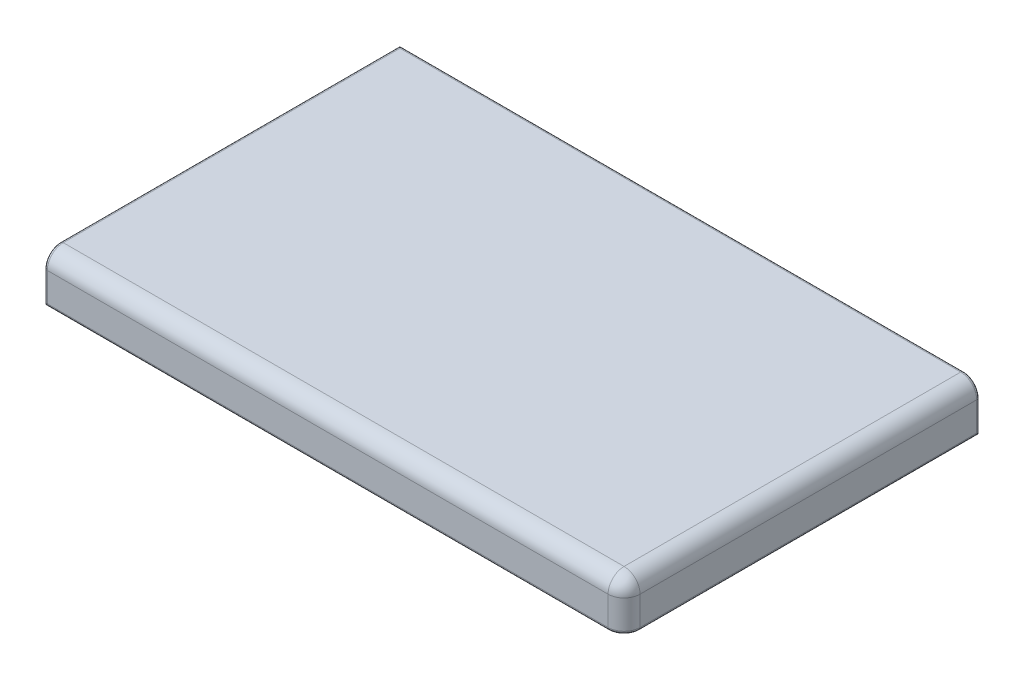
ISO-10303-21;
HEADER;
FILE_DESCRIPTION(('STEP AP214'),'2;1');
FILE_NAME('part.step','',(''),(''),'','','');
FILE_SCHEMA(('AUTOMOTIVE_DESIGN { 1 0 10303 214 1 1 1 1 }'));
ENDSEC;
DATA;
#1=APPLICATION_CONTEXT('core data for automotive mechanical design processes');
#2=APPLICATION_PROTOCOL_DEFINITION('international standard','automotive_design',2000,#1);
#3=PRODUCT_CONTEXT('',#1,'mechanical');
#4=PRODUCT('Part','Part','',(#3));
#5=PRODUCT_RELATED_PRODUCT_CATEGORY('part','',(#4));
#6=PRODUCT_DEFINITION_FORMATION('','',#4);
#7=PRODUCT_DEFINITION_CONTEXT('part definition',#1,'design');
#8=PRODUCT_DEFINITION('design','',#6,#7);
#9=PRODUCT_DEFINITION_SHAPE('','',#8);
#10=(LENGTH_UNIT() NAMED_UNIT(*) SI_UNIT(.MILLI.,.METRE.));
#11=(NAMED_UNIT(*) PLANE_ANGLE_UNIT() SI_UNIT($,.RADIAN.));
#12=(NAMED_UNIT(*) SI_UNIT($,.STERADIAN.) SOLID_ANGLE_UNIT());
#13=UNCERTAINTY_MEASURE_WITH_UNIT(LENGTH_MEASURE(1.E-05),#10,'distance_accuracy_value','');
#14=(GEOMETRIC_REPRESENTATION_CONTEXT(3) GLOBAL_UNCERTAINTY_ASSIGNED_CONTEXT((#13)) GLOBAL_UNIT_ASSIGNED_CONTEXT((#10,
#11,#12)) REPRESENTATION_CONTEXT('',''));
#15=CARTESIAN_POINT('',(0.,0.,0.));
#16=DIRECTION('',(0.,0.,1.));
#17=DIRECTION('',(1.,0.,0.));
#18=AXIS2_PLACEMENT_3D('',#15,#16,#17);
#19=CARTESIAN_POINT('',(1761.00590160156,100.,1146.85656117207));
#20=DIRECTION('',(0.,0.,-1.));
#21=DIRECTION('',(-1.,0.,0.));
#22=AXIS2_PLACEMENT_3D('',#19,#20,#21);
#23=SPHERICAL_SURFACE('',#22,50.);
#24=CARTESIAN_POINT('',(1761.00590160156,100.,1146.85656117207));
#25=DIRECTION('',(-1.,0.,0.));
#26=DIRECTION('',(0.,0.,1.));
#27=AXIS2_PLACEMENT_3D('',#24,#25,#26);
#28=CIRCLE('',#27,50.);
#29=CARTESIAN_POINT('',(1761.00590160156,100.,1196.85656117207));
#30=VERTEX_POINT('',#29);
#31=CARTESIAN_POINT('',(1761.00590160156,150.,1146.85656117207));
#32=VERTEX_POINT('',#31);
#33=EDGE_CURVE('E164',#30,#32,#28,.T.);
#34=ORIENTED_EDGE('',*,*,#33,.F.);
#35=CARTESIAN_POINT('',(1761.00590160156,100.,1146.85656117207));
#36=DIRECTION('',(0.,1.,0.));
#37=DIRECTION('',(0.,0.,1.));
#38=AXIS2_PLACEMENT_3D('',#35,#36,#37);
#39=CIRCLE('',#38,50.);
#40=CARTESIAN_POINT('',(1811.00590160156,100.,1146.85656117207));
#41=VERTEX_POINT('',#40);
#42=EDGE_CURVE('E161',#30,#41,#39,.T.);
#43=ORIENTED_EDGE('',*,*,#42,.T.);
#44=CARTESIAN_POINT('',(1761.00590160156,100.,1146.85656117207));
#45=DIRECTION('',(0.,0.,-1.));
#46=DIRECTION('',(-1.,0.,0.));
#47=AXIS2_PLACEMENT_3D('',#44,#45,#46);
#48=CIRCLE('',#47,50.);
#49=EDGE_CURVE('E156',#32,#41,#48,.T.);
#50=ORIENTED_EDGE('',*,*,#49,.F.);
#51=EDGE_LOOP('',(#34,#43,#50));
#52=FACE_BOUND('',#51,.T.);
#53=ADVANCED_FACE('F33',(#52),#23,.T.);
#54=CARTESIAN_POINT('',(1761.00590160156,150.,1146.85656117207));
#55=DIRECTION('',(0.,1.,0.));
#56=DIRECTION('',(0.,0.,1.));
#57=AXIS2_PLACEMENT_3D('',#54,#55,#56);
#58=CYLINDRICAL_SURFACE('',#57,50.);
#59=DIRECTION('',(0.,1.,0.));
#60=VECTOR('',#59,1.);
#61=CARTESIAN_POINT('',(1761.00590160156,150.,1196.85656117207));
#62=LINE('',#61,#60);
#63=CARTESIAN_POINT('',(1761.00590160156,10.,1196.85656117207));
#64=VERTEX_POINT('',#63);
#65=EDGE_CURVE('E151',#64,#30,#62,.T.);
#66=ORIENTED_EDGE('',*,*,#65,.F.);
#67=CARTESIAN_POINT('',(1761.00590160156,10.,1146.85656117207));
#68=DIRECTION('',(0.,1.,0.));
#69=DIRECTION('',(0.,0.,1.));
#70=AXIS2_PLACEMENT_3D('',#67,#68,#69);
#71=CIRCLE('',#70,50.);
#72=CARTESIAN_POINT('',(1811.00590160156,10.,1146.85656117207));
#73=VERTEX_POINT('',#72);
#74=EDGE_CURVE('E172',#64,#73,#71,.T.);
#75=ORIENTED_EDGE('',*,*,#74,.T.);
#76=DIRECTION('',(0.,1.,0.));
#77=VECTOR('',#76,1.);
#78=CARTESIAN_POINT('',(1811.00590160156,150.,1146.85656117207));
#79=LINE('',#78,#77);
#80=EDGE_CURVE('E153',#41,#73,#79,.F.);
#81=ORIENTED_EDGE('',*,*,#80,.F.);
#82=ORIENTED_EDGE('',*,*,#42,.F.);
#83=EDGE_LOOP('',(#66,#75,#81,#82));
#84=FACE_BOUND('',#83,.T.);
#85=ADVANCED_FACE('F275',(#84),#58,.T.);
#86=CARTESIAN_POINT('',(0.,100.,1146.85656117207));
#87=DIRECTION('',(1.,0.,0.));
#88=DIRECTION('',(0.,0.,-1.));
#89=AXIS2_PLACEMENT_3D('',#86,#87,#88);
#90=CYLINDRICAL_SURFACE('',#89,50.);
#91=DIRECTION('',(-1.,0.,0.));
#92=VECTOR('',#91,1.);
#93=CARTESIAN_POINT('',(0.,150.,1146.85656117207));
#94=LINE('',#93,#92);
#95=CARTESIAN_POINT('',(10.,150.,1146.85656117207));
#96=VERTEX_POINT('',#95);
#97=EDGE_CURVE('E159',#96,#32,#94,.F.);
#98=ORIENTED_EDGE('',*,*,#97,.F.);
#99=CARTESIAN_POINT('',(10.,100.,1146.85656117207));
#100=DIRECTION('',(1.,0.,0.));
#101=DIRECTION('',(0.,0.,-1.));
#102=AXIS2_PLACEMENT_3D('',#99,#100,#101);
#103=CIRCLE('',#102,50.);
#104=CARTESIAN_POINT('',(10.,100.,1196.85656117207));
#105=VERTEX_POINT('',#104);
#106=EDGE_CURVE('E187',#96,#105,#103,.T.);
#107=ORIENTED_EDGE('',*,*,#106,.T.);
#108=DIRECTION('',(-1.,0.,0.));
#109=VECTOR('',#108,1.);
#110=CARTESIAN_POINT('',(0.,100.,1196.85656117207));
#111=LINE('',#110,#109);
#112=EDGE_CURVE('E149',#30,#105,#111,.T.);
#113=ORIENTED_EDGE('',*,*,#112,.F.);
#114=ORIENTED_EDGE('',*,*,#33,.T.);
#115=EDGE_LOOP('',(#98,#107,#113,#114));
#116=FACE_BOUND('',#115,.T.);
#117=ADVANCED_FACE('F231',(#116),#90,.T.);
#118=CARTESIAN_POINT('',(1761.00590160156,100.,85.7246012920427));
#119=DIRECTION('',(0.,0.,-1.));
#120=DIRECTION('',(-1.,0.,0.));
#121=AXIS2_PLACEMENT_3D('',#118,#119,#120);
#122=CYLINDRICAL_SURFACE('',#121,50.);
#123=DIRECTION('',(0.,0.,1.));
#124=VECTOR('',#123,1.);
#125=CARTESIAN_POINT('',(1811.00590160156,100.,85.7246012920427));
#126=LINE('',#125,#124);
#127=CARTESIAN_POINT('',(1811.00590160156,100.,95.7246012920427));
#128=VERTEX_POINT('',#127);
#129=EDGE_CURVE('E128',#128,#41,#126,.T.);
#130=ORIENTED_EDGE('',*,*,#129,.F.);
#131=CARTESIAN_POINT('',(1761.00590160156,100.,95.7246012920427));
#132=DIRECTION('',(0.,0.,1.));
#133=DIRECTION('',(1.,0.,0.));
#134=AXIS2_PLACEMENT_3D('',#131,#132,#133);
#135=CIRCLE('',#134,50.);
#136=CARTESIAN_POINT('',(1761.00590160156,150.,95.7246012920427));
#137=VERTEX_POINT('',#136);
#138=EDGE_CURVE('E180',#128,#137,#135,.T.);
#139=ORIENTED_EDGE('',*,*,#138,.T.);
#140=DIRECTION('',(0.,0.,1.));
#141=VECTOR('',#140,1.);
#142=CARTESIAN_POINT('',(1761.00590160156,150.,85.7246012920427));
#143=LINE('',#142,#141);
#144=EDGE_CURVE('E147',#32,#137,#143,.F.);
#145=ORIENTED_EDGE('',*,*,#144,.F.);
#146=ORIENTED_EDGE('',*,*,#49,.T.);
#147=EDGE_LOOP('',(#130,#139,#145,#146));
#148=FACE_BOUND('',#147,.T.);
#149=ADVANCED_FACE('F241',(#148),#122,.T.);
#150=CARTESIAN_POINT('',(0.,150.,85.7246012920427));
#151=DIRECTION('',(1.,0.,0.));
#152=DIRECTION('',(0.,0.,-1.));
#153=AXIS2_PLACEMENT_3D('',#150,#151,#152);
#154=PLANE('',#153);
#155=DIRECTION('',(0.,0.,1.));
#156=VECTOR('',#155,1.);
#157=CARTESIAN_POINT('',(0.,0.,85.7246012920427));
#158=LINE('',#157,#156);
#159=CARTESIAN_POINT('',(0.,0.,85.7246012920427));
#160=VERTEX_POINT('',#159);
#161=CARTESIAN_POINT('',(0.,0.,1186.85656117207));
#162=VERTEX_POINT('',#161);
#163=EDGE_CURVE('E122',#160,#162,#158,.T.);
#164=ORIENTED_EDGE('',*,*,#163,.T.);
#165=DIRECTION('',(0.,-1.,0.));
#166=VECTOR('',#165,1.);
#167=CARTESIAN_POINT('',(0.,150.,1186.85656117207));
#168=LINE('',#167,#166);
#169=CARTESIAN_POINT('',(0.,100.,1186.85656117207));
#170=VERTEX_POINT('',#169);
#171=EDGE_CURVE('E185',#162,#170,#168,.F.);
#172=ORIENTED_EDGE('',*,*,#171,.T.);
#173=CARTESIAN_POINT('',(0.,100.,1146.85656117207));
#174=DIRECTION('',(1.,0.,0.));
#175=DIRECTION('',(0.,0.,-1.));
#176=AXIS2_PLACEMENT_3D('',#173,#174,#175);
#177=CIRCLE('',#176,40.);
#178=CARTESIAN_POINT('',(0.,140.,1146.85656117207));
#179=VERTEX_POINT('',#178);
#180=EDGE_CURVE('E183',#170,#179,#177,.F.);
#181=ORIENTED_EDGE('',*,*,#180,.T.);
#182=DIRECTION('',(0.,0.,1.));
#183=VECTOR('',#182,1.);
#184=CARTESIAN_POINT('',(0.,140.,85.7246012920427));
#185=LINE('',#184,#183);
#186=CARTESIAN_POINT('',(0.,140.,85.7246012920427));
#187=VERTEX_POINT('',#186);
#188=EDGE_CURVE('E125',#179,#187,#185,.F.);
#189=ORIENTED_EDGE('',*,*,#188,.T.);
#190=DIRECTION('',(0.,-1.,0.));
#191=VECTOR('',#190,1.);
#192=CARTESIAN_POINT('',(0.,150.,85.7246012920427));
#193=LINE('',#192,#191);
#194=EDGE_CURVE('E118',#187,#160,#193,.T.);
#195=ORIENTED_EDGE('',*,*,#194,.T.);
#196=EDGE_LOOP('',(#164,#172,#181,#189,#195));
#197=FACE_BOUND('',#196,.T.);
#198=ADVANCED_FACE('F120',(#197),#154,.F.);
#199=CARTESIAN_POINT('',(0.,150.,1196.85656117207));
#200=DIRECTION('',(0.,0.,-1.));
#201=DIRECTION('',(-1.,0.,0.));
#202=AXIS2_PLACEMENT_3D('',#199,#200,#201);
#203=PLANE('',#202);
#204=ORIENTED_EDGE('',*,*,#112,.T.);
#205=DIRECTION('',(0.,-1.,0.));
#206=VECTOR('',#205,1.);
#207=CARTESIAN_POINT('',(10.,150.,1196.85656117207));
#208=LINE('',#207,#206);
#209=CARTESIAN_POINT('',(10.,10.,1196.85656117207));
#210=VERTEX_POINT('',#209);
#211=EDGE_CURVE('E56',#105,#210,#208,.T.);
#212=ORIENTED_EDGE('',*,*,#211,.T.);
#213=DIRECTION('',(1.,0.,0.));
#214=VECTOR('',#213,1.);
#215=CARTESIAN_POINT('',(0.,10.,1196.85656117207));
#216=LINE('',#215,#214);
#217=EDGE_CURVE('E193',#210,#64,#216,.T.);
#218=ORIENTED_EDGE('',*,*,#217,.T.);
#219=ORIENTED_EDGE('',*,*,#65,.T.);
#220=EDGE_LOOP('',(#204,#212,#218,#219));
#221=FACE_BOUND('',#220,.T.);
#222=ADVANCED_FACE('F392',(#221),#203,.F.);
#223=CARTESIAN_POINT('',(1811.00590160156,150.,85.7246012920427));
#224=DIRECTION('',(-1.,0.,0.));
#225=DIRECTION('',(0.,0.,1.));
#226=AXIS2_PLACEMENT_3D('',#223,#224,#225);
#227=PLANE('',#226);
#228=DIRECTION('',(0.,0.,-1.));
#229=VECTOR('',#228,1.);
#230=CARTESIAN_POINT('',(1811.00590160156,10.,85.7246012920427));
#231=LINE('',#230,#229);
#232=CARTESIAN_POINT('',(1811.00590160156,10.,95.7246012920427));
#233=VERTEX_POINT('',#232);
#234=EDGE_CURVE('E189',#73,#233,#231,.T.);
#235=ORIENTED_EDGE('',*,*,#234,.T.);
#236=DIRECTION('',(0.,-1.,0.));
#237=VECTOR('',#236,1.);
#238=CARTESIAN_POINT('',(1811.00590160156,150.,95.7246012920427));
#239=LINE('',#238,#237);
#240=EDGE_CURVE('E191',#233,#128,#239,.F.);
#241=ORIENTED_EDGE('',*,*,#240,.T.);
#242=ORIENTED_EDGE('',*,*,#129,.T.);
#243=ORIENTED_EDGE('',*,*,#80,.T.);
#244=EDGE_LOOP('',(#235,#241,#242,#243));
#245=FACE_BOUND('',#244,.T.);
#246=ADVANCED_FACE('F243',(#245),#227,.F.);
#247=CARTESIAN_POINT('',(0.,150.,85.7246012920427));
#248=DIRECTION('',(0.,0.,1.));
#249=DIRECTION('',(1.,0.,0.));
#250=AXIS2_PLACEMENT_3D('',#247,#248,#249);
#251=PLANE('',#250);
#252=CARTESIAN_POINT('',(1761.00590160156,100.,85.7246012920427));
#253=DIRECTION('',(0.,0.,1.));
#254=DIRECTION('',(1.,0.,0.));
#255=AXIS2_PLACEMENT_3D('',#252,#253,#254);
#256=CIRCLE('',#255,40.);
#257=CARTESIAN_POINT('',(1761.00590160156,140.,85.7246012920427));
#258=VERTEX_POINT('',#257);
#259=CARTESIAN_POINT('',(1801.00590160156,100.,85.7246012920427));
#260=VERTEX_POINT('',#259);
#261=EDGE_CURVE('E177',#258,#260,#256,.F.);
#262=ORIENTED_EDGE('',*,*,#261,.T.);
#263=DIRECTION('',(0.,-1.,0.));
#264=VECTOR('',#263,1.);
#265=CARTESIAN_POINT('',(1801.00590160156,150.,85.7246012920427));
#266=LINE('',#265,#264);
#267=CARTESIAN_POINT('',(1801.00590160156,0.,85.7246012920427));
#268=VERTEX_POINT('',#267);
#269=EDGE_CURVE('E134',#260,#268,#266,.T.);
#270=ORIENTED_EDGE('',*,*,#269,.T.);
#271=DIRECTION('',(-1.,0.,0.));
#272=VECTOR('',#271,1.);
#273=CARTESIAN_POINT('',(0.,0.,85.7246012920427));
#274=LINE('',#273,#272);
#275=EDGE_CURVE('E129',#268,#160,#274,.T.);
#276=ORIENTED_EDGE('',*,*,#275,.T.);
#277=ORIENTED_EDGE('',*,*,#194,.F.);
#278=DIRECTION('',(-1.,0.,0.));
#279=VECTOR('',#278,1.);
#280=CARTESIAN_POINT('',(1761.00590160156,140.,85.7246012920427));
#281=LINE('',#280,#279);
#282=EDGE_CURVE('E175',#187,#258,#281,.F.);
#283=ORIENTED_EDGE('',*,*,#282,.T.);
#284=EDGE_LOOP('',(#262,#270,#276,#277,#283));
#285=FACE_BOUND('',#284,.T.);
#286=ADVANCED_FACE('F132',(#285),#251,.F.);
#287=CARTESIAN_POINT('',(0.,150.,0.));
#288=DIRECTION('',(0.,1.,0.));
#289=DIRECTION('',(0.,0.,1.));
#290=AXIS2_PLACEMENT_3D('',#287,#288,#289);
#291=PLANE('',#290);
#292=ORIENTED_EDGE('',*,*,#144,.T.);
#293=DIRECTION('',(-1.,0.,0.));
#294=VECTOR('',#293,1.);
#295=CARTESIAN_POINT('',(0.,150.,95.7246012920427));
#296=LINE('',#295,#294);
#297=CARTESIAN_POINT('',(10.,150.,95.7246012920427));
#298=VERTEX_POINT('',#297);
#299=EDGE_CURVE('E11',#137,#298,#296,.T.);
#300=ORIENTED_EDGE('',*,*,#299,.T.);
#301=DIRECTION('',(0.,0.,1.));
#302=VECTOR('',#301,1.);
#303=CARTESIAN_POINT('',(10.,150.,1146.85656117207));
#304=LINE('',#303,#302);
#305=EDGE_CURVE('E42',#298,#96,#304,.T.);
#306=ORIENTED_EDGE('',*,*,#305,.T.);
#307=ORIENTED_EDGE('',*,*,#97,.T.);
#308=EDGE_LOOP('',(#292,#300,#306,#307));
#309=FACE_BOUND('',#308,.T.);
#310=ADVANCED_FACE('F229',(#309),#291,.T.);
#311=CARTESIAN_POINT('',(0.,0.,0.));
#312=DIRECTION('',(0.,1.,0.));
#313=DIRECTION('',(0.,0.,1.));
#314=AXIS2_PLACEMENT_3D('',#311,#312,#313);
#315=PLANE('',#314);
#316=ORIENTED_EDGE('',*,*,#275,.F.);
#317=DIRECTION('',(0.,0.,-1.));
#318=VECTOR('',#317,1.);
#319=CARTESIAN_POINT('',(1801.00590160156,0.,0.));
#320=LINE('',#319,#318);
#321=CARTESIAN_POINT('',(1801.00590160156,0.,1146.85656117207));
#322=VERTEX_POINT('',#321);
#323=EDGE_CURVE('E170',#268,#322,#320,.F.);
#324=ORIENTED_EDGE('',*,*,#323,.T.);
#325=CARTESIAN_POINT('',(1761.00590160156,0.,1146.85656117207));
#326=DIRECTION('',(0.,1.,0.));
#327=DIRECTION('',(0.,0.,1.));
#328=AXIS2_PLACEMENT_3D('',#325,#326,#327);
#329=CIRCLE('',#328,40.);
#330=CARTESIAN_POINT('',(1761.00590160156,0.,1186.85656117207));
#331=VERTEX_POINT('',#330);
#332=EDGE_CURVE('E168',#322,#331,#329,.F.);
#333=ORIENTED_EDGE('',*,*,#332,.T.);
#334=DIRECTION('',(1.,0.,0.));
#335=VECTOR('',#334,1.);
#336=CARTESIAN_POINT('',(0.,0.,1186.85656117207));
#337=LINE('',#336,#335);
#338=EDGE_CURVE('E141',#331,#162,#337,.F.);
#339=ORIENTED_EDGE('',*,*,#338,.T.);
#340=ORIENTED_EDGE('',*,*,#163,.F.);
#341=EDGE_LOOP('',(#316,#324,#333,#339,#340));
#342=FACE_BOUND('',#341,.T.);
#343=ADVANCED_FACE('F138',(#342),#315,.F.);
#344=CARTESIAN_POINT('',(0.,140.,95.7246012920427));
#345=DIRECTION('',(1.,0.,0.));
#346=DIRECTION('',(0.,0.,-1.));
#347=AXIS2_PLACEMENT_3D('',#344,#345,#346);
#348=CYLINDRICAL_SURFACE('',#347,10.);
#349=CARTESIAN_POINT('',(1761.00590160156,140.,95.7246012920427));
#350=DIRECTION('',(1.,0.,0.));
#351=DIRECTION('',(0.,0.,-1.));
#352=AXIS2_PLACEMENT_3D('',#349,#350,#351);
#353=CIRCLE('',#352,10.);
#354=EDGE_CURVE('E144',#258,#137,#353,.T.);
#355=ORIENTED_EDGE('',*,*,#354,.F.);
#356=ORIENTED_EDGE('',*,*,#282,.F.);
#357=CARTESIAN_POINT('',(10.,140.,95.7246012920427));
#358=DIRECTION('',(0.707106781186547,0.,-0.707106781186547));
#359=DIRECTION('',(-0.707106781186547,0.,-0.707106781186547));
#360=AXIS2_PLACEMENT_3D('',#357,#358,#359);
#361=ELLIPSE('',#360,14.1421356237309,10.);
#362=EDGE_CURVE('E37',#298,#187,#361,.F.);
#363=ORIENTED_EDGE('',*,*,#362,.F.);
#364=ORIENTED_EDGE('',*,*,#299,.F.);
#365=EDGE_LOOP('',(#355,#356,#363,#364));
#366=FACE_BOUND('',#365,.T.);
#367=ADVANCED_FACE('F35',(#366),#348,.T.);
#368=CARTESIAN_POINT('',(10.,140.,0.));
#369=DIRECTION('',(0.,0.,-1.));
#370=DIRECTION('',(-1.,0.,0.));
#371=AXIS2_PLACEMENT_3D('',#368,#369,#370);
#372=CYLINDRICAL_SURFACE('',#371,10.);
#373=ORIENTED_EDGE('',*,*,#362,.T.);
#374=ORIENTED_EDGE('',*,*,#188,.F.);
#375=CARTESIAN_POINT('',(10.,140.,1146.85656117207));
#376=DIRECTION('',(0.,0.,1.));
#377=DIRECTION('',(1.,0.,0.));
#378=AXIS2_PLACEMENT_3D('',#375,#376,#377);
#379=CIRCLE('',#378,10.);
#380=EDGE_CURVE('E213',#96,#179,#379,.T.);
#381=ORIENTED_EDGE('',*,*,#380,.F.);
#382=ORIENTED_EDGE('',*,*,#305,.F.);
#383=EDGE_LOOP('',(#373,#374,#381,#382));
#384=FACE_BOUND('',#383,.T.);
#385=ADVANCED_FACE('F226',(#384),#372,.T.);
#386=CARTESIAN_POINT('',(1761.00590160156,100.,95.7246012920427));
#387=DIRECTION('',(0.,0.,1.));
#388=DIRECTION('',(1.,0.,0.));
#389=AXIS2_PLACEMENT_3D('',#386,#387,#388);
#390=TOROIDAL_SURFACE('',#389,40.,10.);
#391=ORIENTED_EDGE('',*,*,#354,.T.);
#392=ORIENTED_EDGE('',*,*,#138,.F.);
#393=CARTESIAN_POINT('',(1801.00590160156,100.,95.7246012920427));
#394=DIRECTION('',(0.,-1.,0.));
#395=DIRECTION('',(0.,0.,-1.));
#396=AXIS2_PLACEMENT_3D('',#393,#394,#395);
#397=CIRCLE('',#396,10.);
#398=EDGE_CURVE('E210',#260,#128,#397,.T.);
#399=ORIENTED_EDGE('',*,*,#398,.F.);
#400=ORIENTED_EDGE('',*,*,#261,.F.);
#401=EDGE_LOOP('',(#391,#392,#399,#400));
#402=FACE_BOUND('',#401,.T.);
#403=ADVANCED_FACE('F220',(#402),#390,.T.);
#404=CARTESIAN_POINT('',(10.,100.,1146.85656117207));
#405=DIRECTION('',(1.,0.,0.));
#406=DIRECTION('',(0.,0.,-1.));
#407=AXIS2_PLACEMENT_3D('',#404,#405,#406);
#408=TOROIDAL_SURFACE('',#407,40.,10.);
#409=ORIENTED_EDGE('',*,*,#380,.T.);
#410=ORIENTED_EDGE('',*,*,#180,.F.);
#411=CARTESIAN_POINT('',(10.,100.,1186.85656117207));
#412=DIRECTION('',(0.,-1.,0.));
#413=DIRECTION('',(0.,0.,-1.));
#414=AXIS2_PLACEMENT_3D('',#411,#412,#413);
#415=CIRCLE('',#414,10.);
#416=EDGE_CURVE('E207',#105,#170,#415,.T.);
#417=ORIENTED_EDGE('',*,*,#416,.F.);
#418=ORIENTED_EDGE('',*,*,#106,.F.);
#419=EDGE_LOOP('',(#409,#410,#417,#418));
#420=FACE_BOUND('',#419,.T.);
#421=ADVANCED_FACE('F265',(#420),#408,.T.);
#422=CARTESIAN_POINT('',(1801.00590160156,150.,95.7246012920427));
#423=DIRECTION('',(0.,-1.,0.));
#424=DIRECTION('',(0.,0.,-1.));
#425=AXIS2_PLACEMENT_3D('',#422,#423,#424);
#426=CYLINDRICAL_SURFACE('',#425,10.);
#427=ORIENTED_EDGE('',*,*,#398,.T.);
#428=ORIENTED_EDGE('',*,*,#240,.F.);
#429=CARTESIAN_POINT('',(1801.00590160156,10.,95.7246012920427));
#430=DIRECTION('',(0.,0.707106781186547,-0.707106781186547));
#431=DIRECTION('',(0.,-0.707106781186547,-0.707106781186547));
#432=AXIS2_PLACEMENT_3D('',#429,#430,#431);
#433=ELLIPSE('',#432,14.1421356237309,10.);
#434=EDGE_CURVE('E204',#268,#233,#433,.F.);
#435=ORIENTED_EDGE('',*,*,#434,.F.);
#436=ORIENTED_EDGE('',*,*,#269,.F.);
#437=EDGE_LOOP('',(#427,#428,#435,#436));
#438=FACE_BOUND('',#437,.T.);
#439=ADVANCED_FACE('F247',(#438),#426,.T.);
#440=CARTESIAN_POINT('',(10.,150.,1186.85656117207));
#441=DIRECTION('',(0.,-1.,0.));
#442=DIRECTION('',(0.,0.,-1.));
#443=AXIS2_PLACEMENT_3D('',#440,#441,#442);
#444=CYLINDRICAL_SURFACE('',#443,10.);
#445=ORIENTED_EDGE('',*,*,#416,.T.);
#446=ORIENTED_EDGE('',*,*,#171,.F.);
#447=CARTESIAN_POINT('',(10.,10.,1186.85656117207));
#448=DIRECTION('',(0.707106781186547,-0.707106781186547,0.));
#449=DIRECTION('',(0.707106781186547,0.707106781186547,0.));
#450=AXIS2_PLACEMENT_3D('',#447,#448,#449);
#451=ELLIPSE('',#450,14.1421356237309,10.);
#452=EDGE_CURVE('E201',#210,#162,#451,.T.);
#453=ORIENTED_EDGE('',*,*,#452,.F.);
#454=ORIENTED_EDGE('',*,*,#211,.F.);
#455=EDGE_LOOP('',(#445,#446,#453,#454));
#456=FACE_BOUND('',#455,.T.);
#457=ADVANCED_FACE('F261',(#456),#444,.T.);
#458=CARTESIAN_POINT('',(1801.00590160156,10.,85.7246012920427));
#459=DIRECTION('',(0.,0.,-1.));
#460=DIRECTION('',(-1.,0.,0.));
#461=AXIS2_PLACEMENT_3D('',#458,#459,#460);
#462=CYLINDRICAL_SURFACE('',#461,10.);
#463=ORIENTED_EDGE('',*,*,#434,.T.);
#464=ORIENTED_EDGE('',*,*,#234,.F.);
#465=CARTESIAN_POINT('',(1801.00590160156,10.,1146.85656117207));
#466=DIRECTION('',(0.,0.,1.));
#467=DIRECTION('',(1.,0.,0.));
#468=AXIS2_PLACEMENT_3D('',#465,#466,#467);
#469=CIRCLE('',#468,10.);
#470=EDGE_CURVE('E199',#322,#73,#469,.T.);
#471=ORIENTED_EDGE('',*,*,#470,.F.);
#472=ORIENTED_EDGE('',*,*,#323,.F.);
#473=EDGE_LOOP('',(#463,#464,#471,#472));
#474=FACE_BOUND('',#473,.T.);
#475=ADVANCED_FACE('F250',(#474),#462,.T.);
#476=CARTESIAN_POINT('',(0.,10.,1186.85656117207));
#477=DIRECTION('',(1.,0.,0.));
#478=DIRECTION('',(0.,0.,-1.));
#479=AXIS2_PLACEMENT_3D('',#476,#477,#478);
#480=CYLINDRICAL_SURFACE('',#479,10.);
#481=ORIENTED_EDGE('',*,*,#452,.T.);
#482=ORIENTED_EDGE('',*,*,#338,.F.);
#483=CARTESIAN_POINT('',(1761.00590160156,10.,1186.85656117207));
#484=DIRECTION('',(1.,0.,0.));
#485=DIRECTION('',(0.,0.,-1.));
#486=AXIS2_PLACEMENT_3D('',#483,#484,#485);
#487=CIRCLE('',#486,10.);
#488=EDGE_CURVE('E197',#64,#331,#487,.T.);
#489=ORIENTED_EDGE('',*,*,#488,.F.);
#490=ORIENTED_EDGE('',*,*,#217,.F.);
#491=EDGE_LOOP('',(#481,#482,#489,#490));
#492=FACE_BOUND('',#491,.T.);
#493=ADVANCED_FACE('F259',(#492),#480,.T.);
#494=CARTESIAN_POINT('',(1761.00590160156,10.,1146.85656117207));
#495=DIRECTION('',(0.,1.,0.));
#496=DIRECTION('',(0.,0.,1.));
#497=AXIS2_PLACEMENT_3D('',#494,#495,#496);
#498=TOROIDAL_SURFACE('',#497,40.,10.);
#499=ORIENTED_EDGE('',*,*,#470,.T.);
#500=ORIENTED_EDGE('',*,*,#74,.F.);
#501=ORIENTED_EDGE('',*,*,#488,.T.);
#502=ORIENTED_EDGE('',*,*,#332,.F.);
#503=EDGE_LOOP('',(#499,#500,#501,#502));
#504=FACE_BOUND('',#503,.T.);
#505=ADVANCED_FACE('F254',(#504),#498,.T.);
#506=CLOSED_SHELL('',(#53,#85,#117,#149,#198,#222,#246,#286,#310,#343,#367,#385,#403,#421,#439,
#457,#475,#493,#505));
#507=MANIFOLD_SOLID_BREP('B2',#506);
#508=ADVANCED_BREP_SHAPE_REPRESENTATION('',(#18,#507),#14);
#509=SHAPE_DEFINITION_REPRESENTATION(#9,#508);
ENDSEC;
END-ISO-10303-21;
